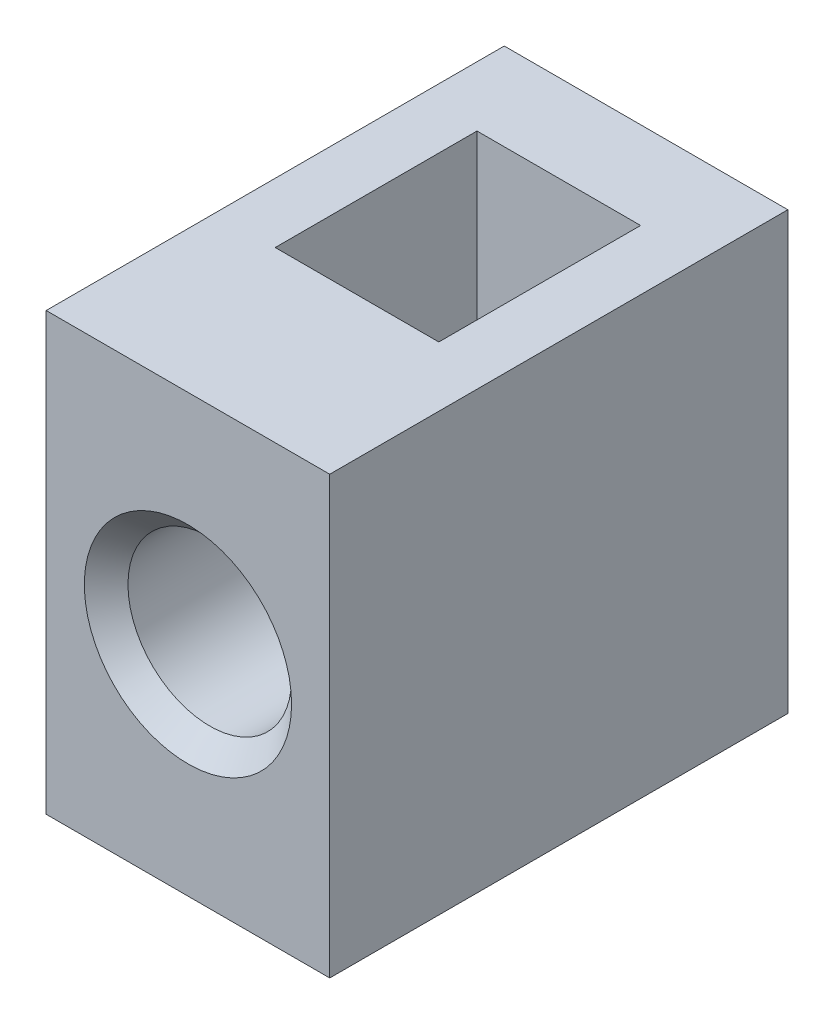
ISO-10303-21;
HEADER;
FILE_DESCRIPTION(('STEP AP214'),'2;1');
FILE_NAME('part.step','',(''),(''),'','','');
FILE_SCHEMA(('AUTOMOTIVE_DESIGN { 1 0 10303 214 1 1 1 1 }'));
ENDSEC;
DATA;
#1=APPLICATION_CONTEXT('core data for automotive mechanical design processes');
#2=APPLICATION_PROTOCOL_DEFINITION('international standard','automotive_design',2000,#1);
#3=PRODUCT_CONTEXT('',#1,'mechanical');
#4=PRODUCT('Part','Part','',(#3));
#5=PRODUCT_RELATED_PRODUCT_CATEGORY('part','',(#4));
#6=PRODUCT_DEFINITION_FORMATION('','',#4);
#7=PRODUCT_DEFINITION_CONTEXT('part definition',#1,'design');
#8=PRODUCT_DEFINITION('design','',#6,#7);
#9=PRODUCT_DEFINITION_SHAPE('','',#8);
#10=(LENGTH_UNIT() NAMED_UNIT(*) SI_UNIT(.MILLI.,.METRE.));
#11=(NAMED_UNIT(*) PLANE_ANGLE_UNIT() SI_UNIT($,.RADIAN.));
#12=(NAMED_UNIT(*) SI_UNIT($,.STERADIAN.) SOLID_ANGLE_UNIT());
#13=UNCERTAINTY_MEASURE_WITH_UNIT(LENGTH_MEASURE(1.E-05),#10,'distance_accuracy_value','');
#14=(GEOMETRIC_REPRESENTATION_CONTEXT(3) GLOBAL_UNCERTAINTY_ASSIGNED_CONTEXT((#13)) GLOBAL_UNIT_ASSIGNED_CONTEXT((#10,
#11,#12)) REPRESENTATION_CONTEXT('',''));
#15=CARTESIAN_POINT('',(0.,0.,0.));
#16=DIRECTION('',(0.,0.,1.));
#17=DIRECTION('',(1.,0.,0.));
#18=AXIS2_PLACEMENT_3D('',#15,#16,#17);
#19=CARTESIAN_POINT('',(0.75,4.356099432828,-1.3));
#20=DIRECTION('',(0.,0.,1.));
#21=DIRECTION('',(1.,0.,0.));
#22=AXIS2_PLACEMENT_3D('',#19,#20,#21);
#23=PLANE('',#22);
#24=DIRECTION('',(1.,0.,0.));
#25=VECTOR('',#24,1.);
#26=CARTESIAN_POINT('',(0.75,2.,-1.3));
#27=LINE('',#26,#25);
#28=CARTESIAN_POINT('',(0.75,2.,-1.3));
#29=VERTEX_POINT('',#28);
#30=CARTESIAN_POINT('',(-0.75,2.,-1.3));
#31=VERTEX_POINT('',#30);
#32=EDGE_CURVE('E119',#29,#31,#27,.F.);
#33=ORIENTED_EDGE('',*,*,#32,.T.);
#34=DIRECTION('',(0.,1.,0.));
#35=VECTOR('',#34,1.);
#36=CARTESIAN_POINT('',(-0.75,4.356099432828,-1.3));
#37=LINE('',#36,#35);
#38=CARTESIAN_POINT('',(-0.75,-2.,-1.3));
#39=VERTEX_POINT('',#38);
#40=EDGE_CURVE('E113',#39,#31,#37,.T.);
#41=ORIENTED_EDGE('',*,*,#40,.F.);
#42=DIRECTION('',(1.,0.,0.));
#43=VECTOR('',#42,1.);
#44=CARTESIAN_POINT('',(0.75,-2.,-1.3));
#45=LINE('',#44,#43);
#46=CARTESIAN_POINT('',(0.75,-2.,-1.3));
#47=VERTEX_POINT('',#46);
#48=EDGE_CURVE('E143',#39,#47,#45,.T.);
#49=ORIENTED_EDGE('',*,*,#48,.T.);
#50=DIRECTION('',(0.,1.,0.));
#51=VECTOR('',#50,1.);
#52=CARTESIAN_POINT('',(0.75,4.356099432828,-1.3));
#53=LINE('',#52,#51);
#54=EDGE_CURVE('E100',#29,#47,#53,.F.);
#55=ORIENTED_EDGE('',*,*,#54,.F.);
#56=EDGE_LOOP('',(#33,#41,#49,#55));
#57=FACE_BOUND('',#56,.T.);
#58=ADVANCED_FACE('F17',(#57),#23,.T.);
#59=CARTESIAN_POINT('',(-0.75,4.356099432828,0.55));
#60=DIRECTION('',(0.,0.,-1.));
#61=DIRECTION('',(-1.,0.,0.));
#62=AXIS2_PLACEMENT_3D('',#59,#60,#61);
#63=PLANE('',#62);
#64=DIRECTION('',(0.,1.,0.));
#65=VECTOR('',#64,1.);
#66=CARTESIAN_POINT('',(-0.75,4.356099432828,0.55));
#67=LINE('',#66,#65);
#68=CARTESIAN_POINT('',(-0.75,2.,0.55));
#69=VERTEX_POINT('',#68);
#70=CARTESIAN_POINT('',(-0.75,0.,0.55));
#71=VERTEX_POINT('',#70);
#72=EDGE_CURVE('E182',#69,#71,#67,.F.);
#73=ORIENTED_EDGE('',*,*,#72,.F.);
#74=DIRECTION('',(-1.,0.,0.));
#75=VECTOR('',#74,1.);
#76=CARTESIAN_POINT('',(-0.75,2.,0.55));
#77=LINE('',#76,#75);
#78=CARTESIAN_POINT('',(0.75,2.,0.55));
#79=VERTEX_POINT('',#78);
#80=EDGE_CURVE('E112',#69,#79,#77,.F.);
#81=ORIENTED_EDGE('',*,*,#80,.T.);
#82=DIRECTION('',(0.,1.,0.));
#83=VECTOR('',#82,1.);
#84=CARTESIAN_POINT('',(0.75,4.356099432828,0.55));
#85=LINE('',#84,#83);
#86=CARTESIAN_POINT('',(0.75,0.,0.55));
#87=VERTEX_POINT('',#86);
#88=EDGE_CURVE('E105',#87,#79,#85,.T.);
#89=ORIENTED_EDGE('',*,*,#88,.F.);
#90=CARTESIAN_POINT('',(0.,0.,0.55));
#91=DIRECTION('',(0.,0.,-1.));
#92=DIRECTION('',(-1.,0.,0.));
#93=AXIS2_PLACEMENT_3D('',#90,#91,#92);
#94=CIRCLE('',#93,0.75);
#95=EDGE_CURVE('E20',#87,#71,#94,.F.);
#96=ORIENTED_EDGE('',*,*,#95,.T.);
#97=EDGE_LOOP('',(#73,#81,#89,#96));
#98=FACE_BOUND('',#97,.T.);
#99=ADVANCED_FACE('F111',(#98),#63,.T.);
#100=CARTESIAN_POINT('',(-0.75,4.356099432828,0.55));
#101=DIRECTION('',(0.,0.,-1.));
#102=DIRECTION('',(-1.,0.,0.));
#103=AXIS2_PLACEMENT_3D('',#100,#101,#102);
#104=PLANE('',#103);
#105=DIRECTION('',(0.,1.,0.));
#106=VECTOR('',#105,1.);
#107=CARTESIAN_POINT('',(0.75,4.356099432828,0.55));
#108=LINE('',#107,#106);
#109=CARTESIAN_POINT('',(0.75,-2.,0.55));
#110=VERTEX_POINT('',#109);
#111=EDGE_CURVE('E95',#110,#87,#108,.T.);
#112=ORIENTED_EDGE('',*,*,#111,.F.);
#113=DIRECTION('',(-1.,0.,0.));
#114=VECTOR('',#113,1.);
#115=CARTESIAN_POINT('',(-0.75,-2.,0.55));
#116=LINE('',#115,#114);
#117=CARTESIAN_POINT('',(-0.75,-2.,0.55));
#118=VERTEX_POINT('',#117);
#119=EDGE_CURVE('E117',#110,#118,#116,.T.);
#120=ORIENTED_EDGE('',*,*,#119,.T.);
#121=DIRECTION('',(0.,1.,0.));
#122=VECTOR('',#121,1.);
#123=CARTESIAN_POINT('',(-0.75,4.356099432828,0.55));
#124=LINE('',#123,#122);
#125=EDGE_CURVE('E98',#71,#118,#124,.F.);
#126=ORIENTED_EDGE('',*,*,#125,.F.);
#127=CARTESIAN_POINT('',(0.,0.,0.55));
#128=DIRECTION('',(0.,0.,-1.));
#129=DIRECTION('',(-1.,0.,0.));
#130=AXIS2_PLACEMENT_3D('',#127,#128,#129);
#131=CIRCLE('',#130,0.75);
#132=EDGE_CURVE('E92',#71,#87,#131,.F.);
#133=ORIENTED_EDGE('',*,*,#132,.T.);
#134=EDGE_LOOP('',(#112,#120,#126,#133));
#135=FACE_BOUND('',#134,.T.);
#136=ADVANCED_FACE('F94',(#135),#104,.T.);
#137=CARTESIAN_POINT('',(0.,0.,-4.256099432828));
#138=DIRECTION('',(0.,0.,-1.));
#139=DIRECTION('',(-1.,0.,0.));
#140=AXIS2_PLACEMENT_3D('',#137,#138,#139);
#141=CYLINDRICAL_SURFACE('',#140,0.75);
#142=ORIENTED_EDGE('',*,*,#95,.F.);
#143=ORIENTED_EDGE('',*,*,#132,.F.);
#144=EDGE_LOOP('',(#142,#143));
#145=FACE_BOUND('',#144,.T.);
#146=CARTESIAN_POINT('',(0.,0.,1.90000000003465));
#147=DIRECTION('',(0.,0.,1.));
#148=DIRECTION('',(1.,0.,0.));
#149=AXIS2_PLACEMENT_3D('',#146,#147,#148);
#150=CIRCLE('',#149,0.749999999982265);
#151=CARTESIAN_POINT('',(0.749999999982265,0.,1.90000000003465));
#152=VERTEX_POINT('',#151);
#153=EDGE_CURVE('E179',#152,#152,#150,.T.);
#154=ORIENTED_EDGE('',*,*,#153,.T.);
#155=EDGE_LOOP('',(#154));
#156=FACE_BOUND('',#155,.T.);
#157=ADVANCED_FACE('F115',(#145,#156),#141,.F.);
#158=CARTESIAN_POINT('',(0.75,4.356099432828,0.55));
#159=DIRECTION('',(-1.,0.,0.));
#160=DIRECTION('',(0.,0.,1.));
#161=AXIS2_PLACEMENT_3D('',#158,#159,#160);
#162=PLANE('',#161);
#163=ORIENTED_EDGE('',*,*,#88,.T.);
#164=DIRECTION('',(0.,0.,1.));
#165=VECTOR('',#164,1.);
#166=CARTESIAN_POINT('',(0.75,2.,0.));
#167=LINE('',#166,#165);
#168=EDGE_CURVE('E138',#29,#79,#167,.T.);
#169=ORIENTED_EDGE('',*,*,#168,.F.);
#170=ORIENTED_EDGE('',*,*,#54,.T.);
#171=DIRECTION('',(0.,0.,1.));
#172=VECTOR('',#171,1.);
#173=CARTESIAN_POINT('',(0.75,-2.,0.));
#174=LINE('',#173,#172);
#175=EDGE_CURVE('E109',#47,#110,#174,.T.);
#176=ORIENTED_EDGE('',*,*,#175,.T.);
#177=ORIENTED_EDGE('',*,*,#111,.T.);
#178=EDGE_LOOP('',(#163,#169,#170,#176,#177));
#179=FACE_BOUND('',#178,.T.);
#180=ADVANCED_FACE('F103',(#179),#162,.T.);
#181=CARTESIAN_POINT('',(-0.75,4.356099432828,-1.3));
#182=DIRECTION('',(1.,0.,0.));
#183=DIRECTION('',(0.,0.,-1.));
#184=AXIS2_PLACEMENT_3D('',#181,#182,#183);
#185=PLANE('',#184);
#186=ORIENTED_EDGE('',*,*,#72,.T.);
#187=ORIENTED_EDGE('',*,*,#125,.T.);
#188=DIRECTION('',(0.,0.,1.));
#189=VECTOR('',#188,1.);
#190=CARTESIAN_POINT('',(-0.75,-2.,0.));
#191=LINE('',#190,#189);
#192=EDGE_CURVE('E127',#118,#39,#191,.F.);
#193=ORIENTED_EDGE('',*,*,#192,.T.);
#194=ORIENTED_EDGE('',*,*,#40,.T.);
#195=DIRECTION('',(0.,0.,1.));
#196=VECTOR('',#195,1.);
#197=CARTESIAN_POINT('',(-0.75,2.,0.));
#198=LINE('',#197,#196);
#199=EDGE_CURVE('E135',#69,#31,#198,.F.);
#200=ORIENTED_EDGE('',*,*,#199,.F.);
#201=EDGE_LOOP('',(#186,#187,#193,#194,#200));
#202=FACE_BOUND('',#201,.T.);
#203=ADVANCED_FACE('F190',(#202),#185,.T.);
#204=CARTESIAN_POINT('',(0.,0.,2.09999999998445));
#205=DIRECTION('',(0.,0.,1.));
#206=DIRECTION('',(1.,0.,0.));
#207=AXIS2_PLACEMENT_3D('',#204,#205,#206);
#208=CONICAL_SURFACE('',#207,0.94999999993206,0.785398163397447);
#209=CARTESIAN_POINT('',(0.,0.,2.09999999998445));
#210=DIRECTION('',(0.,0.,1.));
#211=DIRECTION('',(1.,0.,0.));
#212=AXIS2_PLACEMENT_3D('',#209,#210,#211);
#213=CIRCLE('',#212,0.94999999993206);
#214=CARTESIAN_POINT('',(0.949999999932061,0.,2.09999999998445));
#215=VERTEX_POINT('',#214);
#216=EDGE_CURVE('E130',#215,#215,#213,.F.);
#217=ORIENTED_EDGE('',*,*,#216,.F.);
#218=EDGE_LOOP('',(#217));
#219=FACE_BOUND('',#218,.T.);
#220=ORIENTED_EDGE('',*,*,#153,.F.);
#221=EDGE_LOOP('',(#220));
#222=FACE_BOUND('',#221,.T.);
#223=ADVANCED_FACE('F235',(#219,#222),#208,.F.);
#224=CARTESIAN_POINT('',(1.3,-2.,2.1));
#225=DIRECTION('',(1.,0.,0.));
#226=DIRECTION('',(0.,0.,-1.));
#227=AXIS2_PLACEMENT_3D('',#224,#225,#226);
#228=PLANE('',#227);
#229=DIRECTION('',(0.,0.,1.));
#230=VECTOR('',#229,1.);
#231=CARTESIAN_POINT('',(1.3,-2.,0.));
#232=LINE('',#231,#230);
#233=CARTESIAN_POINT('',(1.3,-2.,2.1));
#234=VERTEX_POINT('',#233);
#235=CARTESIAN_POINT('',(1.3,-2.,-2.1));
#236=VERTEX_POINT('',#235);
#237=EDGE_CURVE('E154',#234,#236,#232,.F.);
#238=ORIENTED_EDGE('',*,*,#237,.T.);
#239=DIRECTION('',(0.,1.,0.));
#240=VECTOR('',#239,1.);
#241=CARTESIAN_POINT('',(1.3,-2.,-2.1));
#242=LINE('',#241,#240);
#243=CARTESIAN_POINT('',(1.3,2.,-2.1));
#244=VERTEX_POINT('',#243);
#245=EDGE_CURVE('E174',#244,#236,#242,.F.);
#246=ORIENTED_EDGE('',*,*,#245,.F.);
#247=DIRECTION('',(0.,0.,1.));
#248=VECTOR('',#247,1.);
#249=CARTESIAN_POINT('',(1.3,2.,0.));
#250=LINE('',#249,#248);
#251=CARTESIAN_POINT('',(1.3,2.,2.1));
#252=VERTEX_POINT('',#251);
#253=EDGE_CURVE('E139',#252,#244,#250,.F.);
#254=ORIENTED_EDGE('',*,*,#253,.F.);
#255=DIRECTION('',(0.,1.,0.));
#256=VECTOR('',#255,1.);
#257=CARTESIAN_POINT('',(1.3,-2.,2.1));
#258=LINE('',#257,#256);
#259=EDGE_CURVE('E166',#234,#252,#258,.T.);
#260=ORIENTED_EDGE('',*,*,#259,.F.);
#261=EDGE_LOOP('',(#238,#246,#254,#260));
#262=FACE_BOUND('',#261,.T.);
#263=ADVANCED_FACE('F202',(#262),#228,.T.);
#264=CARTESIAN_POINT('',(0.,2.,0.));
#265=DIRECTION('',(0.,1.,0.));
#266=DIRECTION('',(0.,0.,1.));
#267=AXIS2_PLACEMENT_3D('',#264,#265,#266);
#268=PLANE('',#267);
#269=ORIENTED_EDGE('',*,*,#32,.F.);
#270=ORIENTED_EDGE('',*,*,#168,.T.);
#271=ORIENTED_EDGE('',*,*,#80,.F.);
#272=ORIENTED_EDGE('',*,*,#199,.T.);
#273=EDGE_LOOP('',(#269,#270,#271,#272));
#274=FACE_BOUND('',#273,.T.);
#275=DIRECTION('',(0.,0.,1.));
#276=VECTOR('',#275,1.);
#277=CARTESIAN_POINT('',(-1.3,2.,-2.1));
#278=LINE('',#277,#276);
#279=CARTESIAN_POINT('',(-1.3,2.,2.1));
#280=VERTEX_POINT('',#279);
#281=CARTESIAN_POINT('',(-1.3,2.,-2.1));
#282=VERTEX_POINT('',#281);
#283=EDGE_CURVE('E205',#280,#282,#278,.F.);
#284=ORIENTED_EDGE('',*,*,#283,.F.);
#285=DIRECTION('',(1.,0.,0.));
#286=VECTOR('',#285,1.);
#287=CARTESIAN_POINT('',(-1.3,2.,2.1));
#288=LINE('',#287,#286);
#289=EDGE_CURVE('E158',#252,#280,#288,.F.);
#290=ORIENTED_EDGE('',*,*,#289,.F.);
#291=ORIENTED_EDGE('',*,*,#253,.T.);
#292=DIRECTION('',(-1.,0.,0.));
#293=VECTOR('',#292,1.);
#294=CARTESIAN_POINT('',(1.3,2.,-2.1));
#295=LINE('',#294,#293);
#296=EDGE_CURVE('E150',#282,#244,#295,.F.);
#297=ORIENTED_EDGE('',*,*,#296,.F.);
#298=EDGE_LOOP('',(#284,#290,#291,#297));
#299=FACE_BOUND('',#298,.T.);
#300=ADVANCED_FACE('F198',(#274,#299),#268,.T.);
#301=CARTESIAN_POINT('',(1.3,-2.,-2.1));
#302=DIRECTION('',(0.,0.,-1.));
#303=DIRECTION('',(-1.,0.,0.));
#304=AXIS2_PLACEMENT_3D('',#301,#302,#303);
#305=PLANE('',#304);
#306=DIRECTION('',(1.,0.,0.));
#307=VECTOR('',#306,1.);
#308=CARTESIAN_POINT('',(0.,-2.,-2.1));
#309=LINE('',#308,#307);
#310=CARTESIAN_POINT('',(-1.3,-2.,-2.1));
#311=VERTEX_POINT('',#310);
#312=EDGE_CURVE('E172',#236,#311,#309,.F.);
#313=ORIENTED_EDGE('',*,*,#312,.T.);
#314=DIRECTION('',(0.,1.,0.));
#315=VECTOR('',#314,1.);
#316=CARTESIAN_POINT('',(-1.3,-2.,-2.1));
#317=LINE('',#316,#315);
#318=EDGE_CURVE('E209',#282,#311,#317,.F.);
#319=ORIENTED_EDGE('',*,*,#318,.F.);
#320=ORIENTED_EDGE('',*,*,#296,.T.);
#321=ORIENTED_EDGE('',*,*,#245,.T.);
#322=EDGE_LOOP('',(#313,#319,#320,#321));
#323=FACE_BOUND('',#322,.T.);
#324=ADVANCED_FACE('F201',(#323),#305,.T.);
#325=CARTESIAN_POINT('',(0.,-2.,0.));
#326=DIRECTION('',(0.,1.,0.));
#327=DIRECTION('',(0.,0.,1.));
#328=AXIS2_PLACEMENT_3D('',#325,#326,#327);
#329=PLANE('',#328);
#330=ORIENTED_EDGE('',*,*,#119,.F.);
#331=ORIENTED_EDGE('',*,*,#175,.F.);
#332=ORIENTED_EDGE('',*,*,#48,.F.);
#333=ORIENTED_EDGE('',*,*,#192,.F.);
#334=EDGE_LOOP('',(#330,#331,#332,#333));
#335=FACE_BOUND('',#334,.T.);
#336=DIRECTION('',(1.,0.,0.));
#337=VECTOR('',#336,1.);
#338=CARTESIAN_POINT('',(-1.3,-2.,2.1));
#339=LINE('',#338,#337);
#340=CARTESIAN_POINT('',(-1.3,-2.,2.1));
#341=VERTEX_POINT('',#340);
#342=EDGE_CURVE('E35',#341,#234,#339,.T.);
#343=ORIENTED_EDGE('',*,*,#342,.F.);
#344=DIRECTION('',(0.,0.,1.));
#345=VECTOR('',#344,1.);
#346=CARTESIAN_POINT('',(-1.3,-2.,-2.1));
#347=LINE('',#346,#345);
#348=EDGE_CURVE('E26',#311,#341,#347,.T.);
#349=ORIENTED_EDGE('',*,*,#348,.F.);
#350=ORIENTED_EDGE('',*,*,#312,.F.);
#351=ORIENTED_EDGE('',*,*,#237,.F.);
#352=EDGE_LOOP('',(#343,#349,#350,#351));
#353=FACE_BOUND('',#352,.T.);
#354=ADVANCED_FACE('F193',(#335,#353),#329,.F.);
#355=CARTESIAN_POINT('',(-1.3,-2.,2.1));
#356=DIRECTION('',(0.,0.,1.));
#357=DIRECTION('',(1.,0.,0.));
#358=AXIS2_PLACEMENT_3D('',#355,#356,#357);
#359=PLANE('',#358);
#360=ORIENTED_EDGE('',*,*,#342,.T.);
#361=ORIENTED_EDGE('',*,*,#259,.T.);
#362=ORIENTED_EDGE('',*,*,#289,.T.);
#363=DIRECTION('',(0.,1.,0.));
#364=VECTOR('',#363,1.);
#365=CARTESIAN_POINT('',(-1.3,-2.,2.1));
#366=LINE('',#365,#364);
#367=EDGE_CURVE('E11',#341,#280,#366,.T.);
#368=ORIENTED_EDGE('',*,*,#367,.F.);
#369=EDGE_LOOP('',(#360,#361,#362,#368));
#370=FACE_BOUND('',#369,.T.);
#371=ORIENTED_EDGE('',*,*,#216,.T.);
#372=EDGE_LOOP('',(#371));
#373=FACE_BOUND('',#372,.T.);
#374=ADVANCED_FACE('F220',(#370,#373),#359,.T.);
#375=CARTESIAN_POINT('',(-1.3,-2.,-2.1));
#376=DIRECTION('',(-1.,0.,0.));
#377=DIRECTION('',(0.,0.,1.));
#378=AXIS2_PLACEMENT_3D('',#375,#376,#377);
#379=PLANE('',#378);
#380=ORIENTED_EDGE('',*,*,#348,.T.);
#381=ORIENTED_EDGE('',*,*,#367,.T.);
#382=ORIENTED_EDGE('',*,*,#283,.T.);
#383=ORIENTED_EDGE('',*,*,#318,.T.);
#384=EDGE_LOOP('',(#380,#381,#382,#383));
#385=FACE_BOUND('',#384,.T.);
#386=ADVANCED_FACE('F214',(#385),#379,.T.);
#387=CLOSED_SHELL('',(#58,#99,#136,#157,#180,#203,#223,#263,#300,#324,#354,#374,#386));
#388=MANIFOLD_SOLID_BREP('B1',#387);
#389=ADVANCED_BREP_SHAPE_REPRESENTATION('',(#18,#388),#14);
#390=SHAPE_DEFINITION_REPRESENTATION(#9,#389);
ENDSEC;
END-ISO-10303-21;
